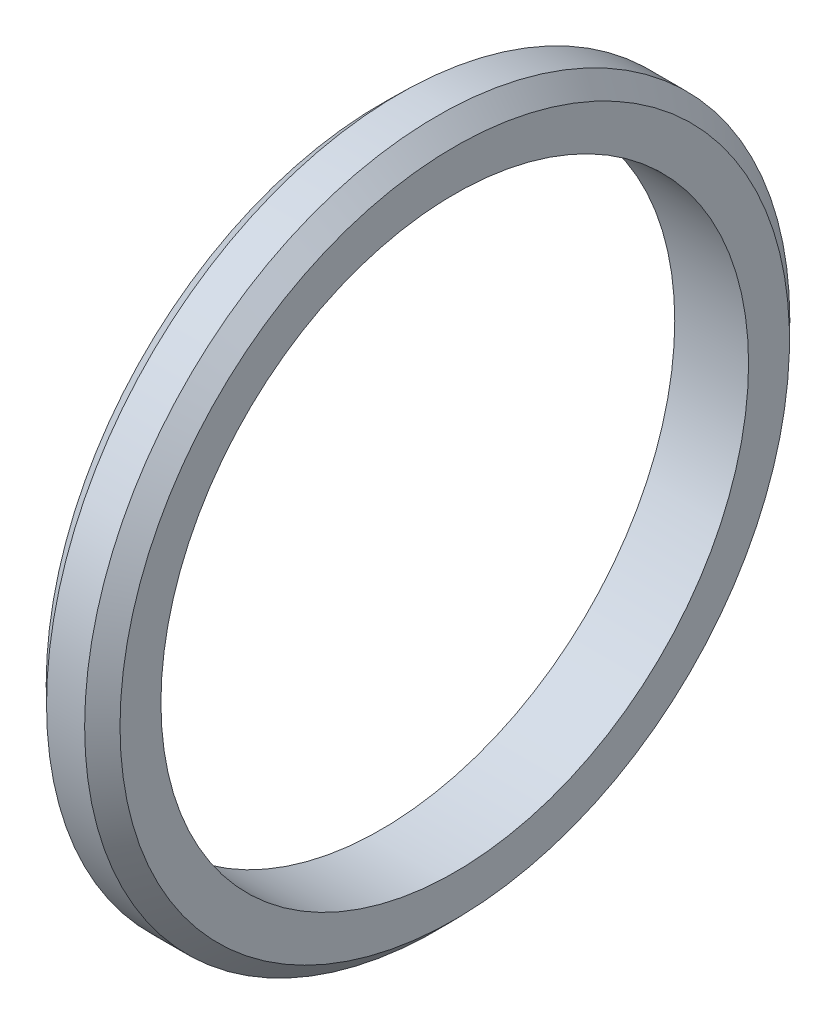
ISO-10303-21;
HEADER;
FILE_DESCRIPTION(('STEP AP214'),'2;1');
FILE_NAME('part.step','',(''),(''),'','','');
FILE_SCHEMA(('AUTOMOTIVE_DESIGN { 1 0 10303 214 1 1 1 1 }'));
ENDSEC;
DATA;
#1=APPLICATION_CONTEXT('core data for automotive mechanical design processes');
#2=APPLICATION_PROTOCOL_DEFINITION('international standard','automotive_design',2000,#1);
#3=PRODUCT_CONTEXT('',#1,'mechanical');
#4=PRODUCT('Part','Part','',(#3));
#5=PRODUCT_RELATED_PRODUCT_CATEGORY('part','',(#4));
#6=PRODUCT_DEFINITION_FORMATION('','',#4);
#7=PRODUCT_DEFINITION_CONTEXT('part definition',#1,'design');
#8=PRODUCT_DEFINITION('design','',#6,#7);
#9=PRODUCT_DEFINITION_SHAPE('','',#8);
#10=(LENGTH_UNIT() NAMED_UNIT(*) SI_UNIT(.MILLI.,.METRE.));
#11=(NAMED_UNIT(*) PLANE_ANGLE_UNIT() SI_UNIT($,.RADIAN.));
#12=(NAMED_UNIT(*) SI_UNIT($,.STERADIAN.) SOLID_ANGLE_UNIT());
#13=UNCERTAINTY_MEASURE_WITH_UNIT(LENGTH_MEASURE(1.E-05),#10,'distance_accuracy_value','');
#14=(GEOMETRIC_REPRESENTATION_CONTEXT(3) GLOBAL_UNCERTAINTY_ASSIGNED_CONTEXT((#13)) GLOBAL_UNIT_ASSIGNED_CONTEXT((#10,
#11,#12)) REPRESENTATION_CONTEXT('',''));
#15=CARTESIAN_POINT('',(0.,0.,0.));
#16=DIRECTION('',(0.,0.,1.));
#17=DIRECTION('',(1.,0.,0.));
#18=AXIS2_PLACEMENT_3D('',#15,#16,#17);
#19=CARTESIAN_POINT('',(-1.9939000000001,0.,-18.0858902843359));
#20=DIRECTION('',(1.,0.,0.));
#21=DIRECTION('',(0.,0.,-1.));
#22=AXIS2_PLACEMENT_3D('',#19,#20,#21);
#23=PLANE('',#22);
#24=CARTESIAN_POINT('',(-1.99389999999999,0.,0.));
#25=DIRECTION('',(-1.,0.,0.));
#26=DIRECTION('',(0.,0.,1.));
#27=AXIS2_PLACEMENT_3D('',#24,#25,#26);
#28=CIRCLE('',#27,15.875);
#29=CARTESIAN_POINT('',(-1.99389999999999,0.,15.875));
#30=VERTEX_POINT('',#29);
#31=EDGE_CURVE('E12',#30,#30,#28,.T.);
#32=ORIENTED_EDGE('',*,*,#31,.F.);
#33=EDGE_LOOP('',(#32));
#34=FACE_BOUND('',#33,.T.);
#35=CARTESIAN_POINT('',(-1.99389999999999,0.,0.));
#36=DIRECTION('',(-1.,0.,0.));
#37=DIRECTION('',(0.,0.,1.));
#38=AXIS2_PLACEMENT_3D('',#35,#36,#37);
#39=CIRCLE('',#38,18.0858902843359);
#40=CARTESIAN_POINT('',(-1.99389999999999,0.,18.0858902843359));
#41=VERTEX_POINT('',#40);
#42=EDGE_CURVE('E60',#41,#41,#39,.T.);
#43=ORIENTED_EDGE('',*,*,#42,.T.);
#44=EDGE_LOOP('',(#43));
#45=FACE_BOUND('',#44,.T.);
#46=ADVANCED_FACE('F38',(#34,#45),#23,.F.);
#47=CARTESIAN_POINT('',(0.,0.,0.));
#48=DIRECTION('',(-1.,0.,0.));
#49=DIRECTION('',(0.,0.,1.));
#50=AXIS2_PLACEMENT_3D('',#47,#48,#49);
#51=CYLINDRICAL_SURFACE('',#50,15.875);
#52=CARTESIAN_POINT('',(1.99389999999999,0.,0.));
#53=DIRECTION('',(-1.,0.,0.));
#54=DIRECTION('',(0.,0.,1.));
#55=AXIS2_PLACEMENT_3D('',#52,#53,#54);
#56=CIRCLE('',#55,15.875);
#57=CARTESIAN_POINT('',(1.99389999999999,0.,15.875));
#58=VERTEX_POINT('',#57);
#59=EDGE_CURVE('E44',#58,#58,#56,.T.);
#60=ORIENTED_EDGE('',*,*,#59,.F.);
#61=EDGE_LOOP('',(#60));
#62=FACE_BOUND('',#61,.T.);
#63=ORIENTED_EDGE('',*,*,#31,.T.);
#64=EDGE_LOOP('',(#63));
#65=FACE_BOUND('',#64,.T.);
#66=ADVANCED_FACE('F85',(#62,#65),#51,.F.);
#67=CARTESIAN_POINT('',(1.99389999999999,0.,-15.875));
#68=DIRECTION('',(-1.,0.,0.));
#69=DIRECTION('',(0.,0.,1.));
#70=AXIS2_PLACEMENT_3D('',#67,#68,#69);
#71=PLANE('',#70);
#72=CARTESIAN_POINT('',(1.99389999999999,0.,0.));
#73=DIRECTION('',(-1.,0.,0.));
#74=DIRECTION('',(0.,0.,1.));
#75=AXIS2_PLACEMENT_3D('',#72,#73,#74);
#76=CIRCLE('',#75,18.0858902843359);
#77=CARTESIAN_POINT('',(1.99389999999999,0.,18.0858902843359));
#78=VERTEX_POINT('',#77);
#79=EDGE_CURVE('E48',#78,#78,#76,.T.);
#80=ORIENTED_EDGE('',*,*,#79,.F.);
#81=EDGE_LOOP('',(#80));
#82=FACE_BOUND('',#81,.T.);
#83=ORIENTED_EDGE('',*,*,#59,.T.);
#84=EDGE_LOOP('',(#83));
#85=FACE_BOUND('',#84,.T.);
#86=ADVANCED_FACE('F80',(#82,#85),#71,.F.);
#87=CARTESIAN_POINT('',(1.99389999999999,0.,0.));
#88=DIRECTION('',(-1.,0.,0.));
#89=DIRECTION('',(0.,0.,1.));
#90=AXIS2_PLACEMENT_3D('',#87,#88,#89);
#91=CONICAL_SURFACE('',#90,18.0858902843359,0.794342260667096);
#92=CARTESIAN_POINT('',(1.04688403414385,0.,-1.11022302462516E-13));
#93=DIRECTION('',(-1.,0.,0.));
#94=DIRECTION('',(0.,0.,1.));
#95=AXIS2_PLACEMENT_3D('',#92,#93,#94);
#96=CIRCLE('',#95,19.05);
#97=CARTESIAN_POINT('',(1.04688403414385,0.,19.0499999999999));
#98=VERTEX_POINT('',#97);
#99=EDGE_CURVE('E52',#98,#98,#96,.T.);
#100=ORIENTED_EDGE('',*,*,#99,.F.);
#101=EDGE_LOOP('',(#100));
#102=FACE_BOUND('',#101,.T.);
#103=ORIENTED_EDGE('',*,*,#79,.T.);
#104=EDGE_LOOP('',(#103));
#105=FACE_BOUND('',#104,.T.);
#106=ADVANCED_FACE('F74',(#102,#105),#91,.T.);
#107=CARTESIAN_POINT('',(0.,0.,0.));
#108=DIRECTION('',(-1.,0.,0.));
#109=DIRECTION('',(0.,0.,1.));
#110=AXIS2_PLACEMENT_3D('',#107,#108,#109);
#111=CYLINDRICAL_SURFACE('',#110,19.05);
#112=CARTESIAN_POINT('',(-1.01238799032899,0.,0.));
#113=DIRECTION('',(-1.,0.,0.));
#114=DIRECTION('',(0.,0.,1.));
#115=AXIS2_PLACEMENT_3D('',#112,#113,#114);
#116=CIRCLE('',#115,19.05);
#117=CARTESIAN_POINT('',(-1.01238799032899,0.,19.05));
#118=VERTEX_POINT('',#117);
#119=EDGE_CURVE('E57',#118,#118,#116,.T.);
#120=ORIENTED_EDGE('',*,*,#119,.F.);
#121=EDGE_LOOP('',(#120));
#122=FACE_BOUND('',#121,.T.);
#123=ORIENTED_EDGE('',*,*,#99,.T.);
#124=EDGE_LOOP('',(#123));
#125=FACE_BOUND('',#124,.T.);
#126=ADVANCED_FACE('F68',(#122,#125),#111,.T.);
#127=CARTESIAN_POINT('',(-1.01238799032899,0.,0.));
#128=DIRECTION('',(1.,0.,0.));
#129=DIRECTION('',(0.,0.,-1.));
#130=AXIS2_PLACEMENT_3D('',#127,#128,#129);
#131=CONICAL_SURFACE('',#130,19.05,0.776454066127801);
#132=ORIENTED_EDGE('',*,*,#42,.F.);
#133=EDGE_LOOP('',(#132));
#134=FACE_BOUND('',#133,.T.);
#135=ORIENTED_EDGE('',*,*,#119,.T.);
#136=EDGE_LOOP('',(#135));
#137=FACE_BOUND('',#136,.T.);
#138=ADVANCED_FACE('F65',(#134,#137),#131,.T.);
#139=CLOSED_SHELL('',(#46,#66,#86,#106,#126,#138));
#140=MANIFOLD_SOLID_BREP('B2',#139);
#141=ADVANCED_BREP_SHAPE_REPRESENTATION('',(#18,#140),#14);
#142=SHAPE_DEFINITION_REPRESENTATION(#9,#141);
ENDSEC;
END-ISO-10303-21;
